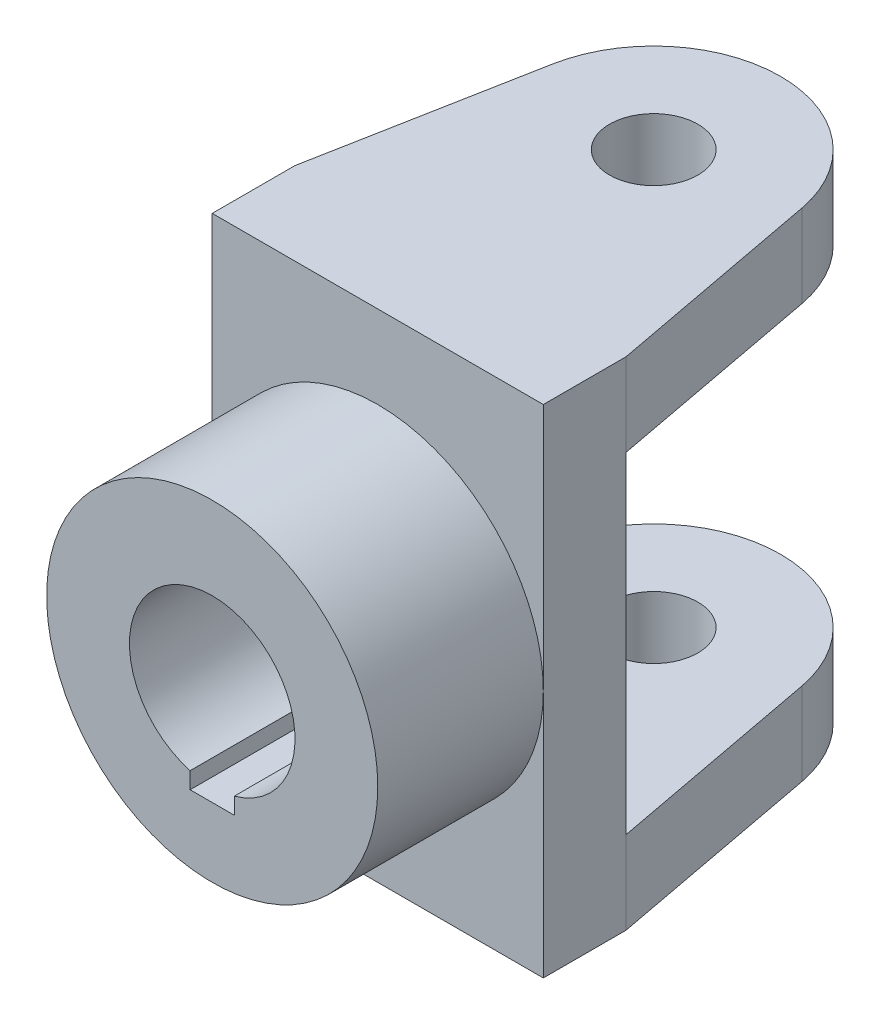
ISO-10303-21;
HEADER;
FILE_DESCRIPTION(('STEP AP214'),'2;1');
FILE_NAME('part.step','',(''),(''),'','','');
FILE_SCHEMA(('AUTOMOTIVE_DESIGN { 1 0 10303 214 1 1 1 1 }'));
ENDSEC;
DATA;
#1=APPLICATION_CONTEXT('core data for automotive mechanical design processes');
#2=APPLICATION_PROTOCOL_DEFINITION('international standard','automotive_design',2000,#1);
#3=PRODUCT_CONTEXT('',#1,'mechanical');
#4=PRODUCT('Part','Part','',(#3));
#5=PRODUCT_RELATED_PRODUCT_CATEGORY('part','',(#4));
#6=PRODUCT_DEFINITION_FORMATION('','',#4);
#7=PRODUCT_DEFINITION_CONTEXT('part definition',#1,'design');
#8=PRODUCT_DEFINITION('design','',#6,#7);
#9=PRODUCT_DEFINITION_SHAPE('','',#8);
#10=(LENGTH_UNIT() NAMED_UNIT(*) SI_UNIT(.MILLI.,.METRE.));
#11=(NAMED_UNIT(*) PLANE_ANGLE_UNIT() SI_UNIT($,.RADIAN.));
#12=(NAMED_UNIT(*) SI_UNIT($,.STERADIAN.) SOLID_ANGLE_UNIT());
#13=UNCERTAINTY_MEASURE_WITH_UNIT(LENGTH_MEASURE(1.E-05),#10,'distance_accuracy_value','');
#14=(GEOMETRIC_REPRESENTATION_CONTEXT(3) GLOBAL_UNCERTAINTY_ASSIGNED_CONTEXT((#13)) GLOBAL_UNIT_ASSIGNED_CONTEXT((#10,
#11,#12)) REPRESENTATION_CONTEXT('',''));
#15=CARTESIAN_POINT('',(0.,0.,0.));
#16=DIRECTION('',(0.,0.,1.));
#17=DIRECTION('',(1.,0.,0.));
#18=AXIS2_PLACEMENT_3D('',#15,#16,#17);
#19=CARTESIAN_POINT('',(22.6022234410614,-90.,-4.25904866376691));
#20=DIRECTION('',(0.98270536700267,0.,-0.185176028859431));
#21=DIRECTION('',(-0.185176028859431,0.,-0.98270536700267));
#22=AXIS2_PLACEMENT_3D('',#19,#20,#21);
#23=PLANE('',#22);
#24=DIRECTION('',(0.185176028859431,0.,0.98270536700267));
#25=VECTOR('',#24,1.);
#26=CARTESIAN_POINT('',(22.6022234410614,-15.,-4.25904866376691));
#27=LINE('',#26,#25);
#28=CARTESIAN_POINT('',(22.6022234410614,-15.,-4.25904866376691));
#29=VERTEX_POINT('',#28);
#30=CARTESIAN_POINT('',(30.,-15.,35.));
#31=VERTEX_POINT('',#30);
#32=EDGE_CURVE('E238',#29,#31,#27,.T.);
#33=ORIENTED_EDGE('',*,*,#32,.F.);
#34=DIRECTION('',(0.,1.,0.));
#35=VECTOR('',#34,1.);
#36=CARTESIAN_POINT('',(22.6022234410614,-90.,-4.25904866376691));
#37=LINE('',#36,#35);
#38=CARTESIAN_POINT('',(22.6022234410614,0.,-4.25904866376691));
#39=VERTEX_POINT('',#38);
#40=EDGE_CURVE('E185',#29,#39,#37,.T.);
#41=ORIENTED_EDGE('',*,*,#40,.T.);
#42=DIRECTION('',(-0.185176028859431,0.,-0.98270536700267));
#43=VECTOR('',#42,1.);
#44=CARTESIAN_POINT('',(22.6022234410614,0.,-4.25904866376691));
#45=LINE('',#44,#43);
#46=CARTESIAN_POINT('',(30.,0.,35.));
#47=VERTEX_POINT('',#46);
#48=EDGE_CURVE('E261',#47,#39,#45,.T.);
#49=ORIENTED_EDGE('',*,*,#48,.F.);
#50=DIRECTION('',(0.,1.,0.));
#51=VECTOR('',#50,1.);
#52=CARTESIAN_POINT('',(30.,-90.,35.));
#53=LINE('',#52,#51);
#54=EDGE_CURVE('E198',#31,#47,#53,.T.);
#55=ORIENTED_EDGE('',*,*,#54,.F.);
#56=EDGE_LOOP('',(#33,#41,#49,#55));
#57=FACE_BOUND('',#56,.T.);
#58=ADVANCED_FACE('F35',(#57),#23,.T.);
#59=CARTESIAN_POINT('',(-22.6022234410614,-90.,-4.25904866376691));
#60=DIRECTION('',(0.982705367002669,0.,0.185176028859431));
#61=DIRECTION('',(0.185176028859431,0.,-0.98270536700267));
#62=AXIS2_PLACEMENT_3D('',#59,#60,#61);
#63=PLANE('',#62);
#64=DIRECTION('',(0.,1.,0.));
#65=VECTOR('',#64,1.);
#66=CARTESIAN_POINT('',(-22.6022234410614,-90.,-4.2590486637669));
#67=LINE('',#66,#65);
#68=CARTESIAN_POINT('',(-22.6022234410614,-15.,-4.2590486637669));
#69=VERTEX_POINT('',#68);
#70=CARTESIAN_POINT('',(-22.6022234410614,0.,-4.2590486637669));
#71=VERTEX_POINT('',#70);
#72=EDGE_CURVE('E181',#69,#71,#67,.T.);
#73=ORIENTED_EDGE('',*,*,#72,.F.);
#74=DIRECTION('',(-0.185176028859431,0.,0.98270536700267));
#75=VECTOR('',#74,1.);
#76=CARTESIAN_POINT('',(-22.6022234410614,-15.,-4.25904866376691));
#77=LINE('',#76,#75);
#78=CARTESIAN_POINT('',(-30.,-15.,35.));
#79=VERTEX_POINT('',#78);
#80=EDGE_CURVE('E240',#69,#79,#77,.T.);
#81=ORIENTED_EDGE('',*,*,#80,.T.);
#82=DIRECTION('',(0.,1.,0.));
#83=VECTOR('',#82,1.);
#84=CARTESIAN_POINT('',(-30.,-90.,35.));
#85=LINE('',#84,#83);
#86=CARTESIAN_POINT('',(-30.,0.,35.));
#87=VERTEX_POINT('',#86);
#88=EDGE_CURVE('E168',#79,#87,#85,.T.);
#89=ORIENTED_EDGE('',*,*,#88,.T.);
#90=DIRECTION('',(0.185176028859431,0.,-0.982705367002669));
#91=VECTOR('',#90,1.);
#92=CARTESIAN_POINT('',(-22.6022234410614,0.,-4.25904866376691));
#93=LINE('',#92,#91);
#94=EDGE_CURVE('E299',#87,#71,#93,.T.);
#95=ORIENTED_EDGE('',*,*,#94,.T.);
#96=EDGE_LOOP('',(#73,#81,#89,#95));
#97=FACE_BOUND('',#96,.T.);
#98=ADVANCED_FACE('F325',(#97),#63,.F.);
#99=CARTESIAN_POINT('',(0.,-90.,0.));
#100=DIRECTION('',(0.,1.,0.));
#101=DIRECTION('',(0.,0.,1.));
#102=AXIS2_PLACEMENT_3D('',#99,#100,#101);
#103=CYLINDRICAL_SURFACE('',#102,23.);
#104=ORIENTED_EDGE('',*,*,#40,.F.);
#105=CARTESIAN_POINT('',(0.,-15.,0.));
#106=DIRECTION('',(0.,1.,0.));
#107=DIRECTION('',(0.,0.,1.));
#108=AXIS2_PLACEMENT_3D('',#105,#106,#107);
#109=CIRCLE('',#108,23.);
#110=EDGE_CURVE('E11',#69,#29,#109,.F.);
#111=ORIENTED_EDGE('',*,*,#110,.F.);
#112=ORIENTED_EDGE('',*,*,#72,.T.);
#113=CARTESIAN_POINT('',(0.,0.,0.));
#114=DIRECTION('',(0.,1.,0.));
#115=DIRECTION('',(0.,0.,1.));
#116=AXIS2_PLACEMENT_3D('',#113,#114,#115);
#117=CIRCLE('',#116,23.);
#118=EDGE_CURVE('E296',#39,#71,#117,.T.);
#119=ORIENTED_EDGE('',*,*,#118,.F.);
#120=EDGE_LOOP('',(#104,#111,#112,#119));
#121=FACE_BOUND('',#120,.T.);
#122=ADVANCED_FACE('F330',(#121),#103,.T.);
#123=CARTESIAN_POINT('',(0.,-90.,0.));
#124=DIRECTION('',(0.,1.,0.));
#125=DIRECTION('',(0.,0.,1.));
#126=AXIS2_PLACEMENT_3D('',#123,#124,#125);
#127=CYLINDRICAL_SURFACE('',#126,8.);
#128=CARTESIAN_POINT('',(0.,-15.,0.));
#129=DIRECTION('',(0.,1.,0.));
#130=DIRECTION('',(0.,0.,1.));
#131=AXIS2_PLACEMENT_3D('',#128,#129,#130);
#132=CIRCLE('',#131,8.);
#133=CARTESIAN_POINT('',(0.,-15.,8.));
#134=VERTEX_POINT('',#133);
#135=EDGE_CURVE('E235',#134,#134,#132,.F.);
#136=CARTESIAN_POINT('',(0.,0.,0.));
#137=DIRECTION('',(0.,1.,0.));
#138=DIRECTION('',(0.,0.,1.));
#139=AXIS2_PLACEMENT_3D('',#136,#137,#138);
#140=CIRCLE('',#139,8.);
#141=CARTESIAN_POINT('',(0.,0.,8.));
#142=VERTEX_POINT('',#141);
#143=EDGE_CURVE('E206',#142,#142,#140,.T.);
#144=CARTESIAN_POINT('',(0.,-15.,8.));
#145=CARTESIAN_POINT('',(0.,-14.84375,8.));
#146=CARTESIAN_POINT('',(0.,-14.6875,8.));
#147=CARTESIAN_POINT('',(0.,-14.375,8.));
#148=CARTESIAN_POINT('',(0.,-14.21875,8.));
#149=CARTESIAN_POINT('',(0.,-13.90625,8.));
#150=CARTESIAN_POINT('',(0.,-13.75,8.));
#151=CARTESIAN_POINT('',(0.,-13.4375,8.));
#152=CARTESIAN_POINT('',(0.,-13.28125,8.));
#153=CARTESIAN_POINT('',(0.,-12.96875,8.));
#154=CARTESIAN_POINT('',(0.,-12.8125,8.));
#155=CARTESIAN_POINT('',(0.,-12.5,8.));
#156=CARTESIAN_POINT('',(0.,-12.34375,8.));
#157=CARTESIAN_POINT('',(0.,-12.03125,8.));
#158=CARTESIAN_POINT('',(0.,-11.875,8.));
#159=CARTESIAN_POINT('',(0.,-11.5625,8.));
#160=CARTESIAN_POINT('',(0.,-11.40625,8.));
#161=CARTESIAN_POINT('',(0.,-11.09375,8.));
#162=CARTESIAN_POINT('',(0.,-10.9375,8.));
#163=CARTESIAN_POINT('',(0.,-10.625,8.));
#164=CARTESIAN_POINT('',(0.,-10.46875,8.));
#165=CARTESIAN_POINT('',(0.,-10.15625,8.));
#166=CARTESIAN_POINT('',(0.,-10.,8.));
#167=CARTESIAN_POINT('',(0.,-9.6875,8.));
#168=CARTESIAN_POINT('',(0.,-9.53125000000001,8.));
#169=CARTESIAN_POINT('',(0.,-9.21875000000001,8.));
#170=CARTESIAN_POINT('',(0.,-9.06250000000001,8.));
#171=CARTESIAN_POINT('',(0.,-8.75,8.));
#172=CARTESIAN_POINT('',(0.,-8.59375,8.));
#173=CARTESIAN_POINT('',(0.,-8.28125,8.));
#174=CARTESIAN_POINT('',(0.,-8.12500000000001,8.));
#175=CARTESIAN_POINT('',(0.,-7.81250000000001,8.));
#176=CARTESIAN_POINT('',(0.,-7.65625000000001,8.));
#177=CARTESIAN_POINT('',(0.,-7.34375000000001,8.));
#178=CARTESIAN_POINT('',(0.,-7.1875,8.));
#179=CARTESIAN_POINT('',(0.,-6.87500000000001,8.));
#180=CARTESIAN_POINT('',(0.,-6.71875000000001,8.));
#181=CARTESIAN_POINT('',(0.,-6.40625000000001,8.));
#182=CARTESIAN_POINT('',(0.,-6.25000000000001,8.));
#183=CARTESIAN_POINT('',(0.,-5.93750000000001,8.));
#184=CARTESIAN_POINT('',(0.,-5.78125000000001,8.));
#185=CARTESIAN_POINT('',(0.,-5.46875000000001,8.));
#186=CARTESIAN_POINT('',(0.,-5.31250000000001,8.));
#187=CARTESIAN_POINT('',(0.,-5.00000000000001,8.));
#188=CARTESIAN_POINT('',(0.,-4.84375000000001,8.));
#189=CARTESIAN_POINT('',(0.,-4.53125000000001,8.));
#190=CARTESIAN_POINT('',(0.,-4.37500000000001,8.));
#191=CARTESIAN_POINT('',(0.,-4.06250000000001,8.));
#192=CARTESIAN_POINT('',(0.,-3.90625000000001,8.));
#193=CARTESIAN_POINT('',(0.,-3.59375000000002,8.));
#194=CARTESIAN_POINT('',(0.,-3.43750000000001,8.));
#195=CARTESIAN_POINT('',(0.,-3.12500000000001,8.));
#196=CARTESIAN_POINT('',(0.,-2.96875000000001,8.));
#197=CARTESIAN_POINT('',(0.,-2.65625000000001,8.));
#198=CARTESIAN_POINT('',(0.,-2.50000000000002,8.));
#199=CARTESIAN_POINT('',(0.,-2.18750000000002,8.));
#200=CARTESIAN_POINT('',(0.,-2.03125000000002,8.));
#201=CARTESIAN_POINT('',(0.,-1.71875000000001,8.));
#202=CARTESIAN_POINT('',(0.,-1.56250000000001,8.));
#203=CARTESIAN_POINT('',(0.,-1.25000000000001,8.));
#204=CARTESIAN_POINT('',(0.,-1.09375000000001,8.));
#205=CARTESIAN_POINT('',(0.,-0.781250000000011,8.));
#206=CARTESIAN_POINT('',(0.,-0.625000000000014,8.));
#207=CARTESIAN_POINT('',(0.,-0.312500000000016,8.));
#208=CARTESIAN_POINT('',(0.,-0.156250000000015,8.));
#209=CARTESIAN_POINT('',(0.,0.,8.));
#210=B_SPLINE_CURVE_WITH_KNOTS('',3,(#144,#145,#146,#147,#148,#149,#150,#151,#152,#153,#154,
#155,#156,#157,#158,#159,#160,#161,#162,#163,#164,#165,#166,#167,#168,#169,#170,#171,#172,#173,
#174,#175,#176,#177,#178,#179,#180,#181,#182,#183,#184,#185,#186,#187,#188,#189,#190,#191,#192,
#193,#194,#195,#196,#197,#198,#199,#200,#201,#202,#203,#204,#205,#206,#207,#208,#209),
.UNSPECIFIED.,.F.,.F.,(4,2,2,2,2,2,2,2,2,2,2,2,2,2,2,2,2,2,2,2,2,2,2,2,2,2,2,2,2,2,2,2,4),(0.,
0.468750000000004,0.937499999999994,1.40625,1.875,2.34374999999999,2.8125,3.28125,3.75,
4.21874999999999,4.6875,5.15625,5.62499999999999,6.09374999999999,6.5625,7.03124999999999,
7.49999999999999,7.96875,8.43749999999999,8.90624999999999,9.37499999999999,9.84374999999998,
10.3125,10.78125,11.25,11.71875,12.1875,12.65625,13.125,13.59375,14.0625,14.53125,15.),.UNSPECIFIED.);
#211=EDGE_CURVE('BSEAM332',#134,#142,#210,.T.);
#212=ORIENTED_EDGE('',*,*,#135,.T.);
#213=ORIENTED_EDGE('',*,*,#143,.T.);
#214=ORIENTED_EDGE('',*,*,#211,.T.);
#215=ORIENTED_EDGE('',*,*,#211,.F.);
#216=EDGE_LOOP('',(#212,#214,#213,#215));
#217=FACE_BOUND('',#216,.T.);
#218=ADVANCED_FACE('F332',(#217),#127,.F.);
#219=CARTESIAN_POINT('',(0.,-90.,50.));
#220=DIRECTION('',(0.,0.,1.));
#221=DIRECTION('',(1.,0.,0.));
#222=AXIS2_PLACEMENT_3D('',#219,#220,#221);
#223=PLANE('',#222);
#224=CARTESIAN_POINT('',(0.,-45.,50.));
#225=DIRECTION('',(0.,0.,1.));
#226=DIRECTION('',(1.,0.,0.));
#227=AXIS2_PLACEMENT_3D('',#224,#225,#226);
#228=CIRCLE('',#227,30.);
#229=CARTESIAN_POINT('',(30.,-45.,50.));
#230=VERTEX_POINT('',#229);
#231=CARTESIAN_POINT('',(-30.,-45.,50.));
#232=VERTEX_POINT('',#231);
#233=EDGE_CURVE('E194',#230,#232,#228,.T.);
#234=ORIENTED_EDGE('',*,*,#233,.F.);
#235=DIRECTION('',(0.,1.,0.));
#236=VECTOR('',#235,1.);
#237=CARTESIAN_POINT('',(30.,-90.,50.));
#238=LINE('',#237,#236);
#239=CARTESIAN_POINT('',(30.,0.,50.));
#240=VERTEX_POINT('',#239);
#241=EDGE_CURVE('E309',#230,#240,#238,.T.);
#242=ORIENTED_EDGE('',*,*,#241,.T.);
#243=DIRECTION('',(1.,0.,0.));
#244=VECTOR('',#243,1.);
#245=CARTESIAN_POINT('',(0.,0.,50.));
#246=LINE('',#245,#244);
#247=CARTESIAN_POINT('',(-30.,0.,50.));
#248=VERTEX_POINT('',#247);
#249=EDGE_CURVE('E305',#248,#240,#246,.T.);
#250=ORIENTED_EDGE('',*,*,#249,.F.);
#251=DIRECTION('',(0.,1.,0.));
#252=VECTOR('',#251,1.);
#253=CARTESIAN_POINT('',(-30.,-90.,50.));
#254=LINE('',#253,#252);
#255=EDGE_CURVE('E173',#232,#248,#254,.T.);
#256=ORIENTED_EDGE('',*,*,#255,.F.);
#257=EDGE_LOOP('',(#234,#242,#250,#256));
#258=FACE_BOUND('',#257,.T.);
#259=ADVANCED_FACE('F318',(#258),#223,.T.);
#260=DIRECTION('',(-0.185176028859431,0.,-0.98270536700267));
#261=VECTOR('',#260,1.);
#262=CARTESIAN_POINT('',(22.6022234410614,-75.,-4.25904866376691));
#263=LINE('',#262,#261);
#264=CARTESIAN_POINT('',(30.,-75.,35.));
#265=VERTEX_POINT('',#264);
#266=CARTESIAN_POINT('',(22.6022234410614,-75.,-4.25904866376691));
#267=VERTEX_POINT('',#266);
#268=EDGE_CURVE('E50',#265,#267,#263,.T.);
#269=ORIENTED_EDGE('',*,*,#268,.F.);
#270=CARTESIAN_POINT('',(30.,-90.,35.));
#271=VERTEX_POINT('',#270);
#272=EDGE_CURVE('E192',#271,#265,#53,.T.);
#273=ORIENTED_EDGE('',*,*,#272,.F.);
#274=DIRECTION('',(-0.185176028859431,0.,-0.98270536700267));
#275=VECTOR('',#274,1.);
#276=CARTESIAN_POINT('',(22.6022234410614,-90.,-4.25904866376691));
#277=LINE('',#276,#275);
#278=CARTESIAN_POINT('',(22.6022234410614,-90.,-4.25904866376691));
#279=VERTEX_POINT('',#278);
#280=EDGE_CURVE('E274',#271,#279,#277,.T.);
#281=ORIENTED_EDGE('',*,*,#280,.T.);
#282=EDGE_CURVE('E182',#279,#267,#37,.T.);
#283=ORIENTED_EDGE('',*,*,#282,.T.);
#284=EDGE_LOOP('',(#269,#273,#281,#283));
#285=FACE_BOUND('',#284,.T.);
#286=ADVANCED_FACE('F273',(#285),#23,.T.);
#287=CARTESIAN_POINT('',(30.,-90.,0.));
#288=DIRECTION('',(-1.,0.,0.));
#289=DIRECTION('',(0.,0.,1.));
#290=AXIS2_PLACEMENT_3D('',#287,#288,#289);
#291=PLANE('',#290);
#292=DIRECTION('',(0.,0.,1.));
#293=VECTOR('',#292,1.);
#294=CARTESIAN_POINT('',(30.,0.,0.));
#295=LINE('',#294,#293);
#296=EDGE_CURVE('E308',#47,#240,#295,.T.);
#297=ORIENTED_EDGE('',*,*,#296,.T.);
#298=ORIENTED_EDGE('',*,*,#241,.F.);
#299=CARTESIAN_POINT('',(30.,-90.,50.));
#300=VERTEX_POINT('',#299);
#301=EDGE_CURVE('E265',#300,#230,#238,.T.);
#302=ORIENTED_EDGE('',*,*,#301,.F.);
#303=DIRECTION('',(0.,0.,1.));
#304=VECTOR('',#303,1.);
#305=CARTESIAN_POINT('',(30.,-90.,0.));
#306=LINE('',#305,#304);
#307=EDGE_CURVE('E269',#271,#300,#306,.T.);
#308=ORIENTED_EDGE('',*,*,#307,.F.);
#309=ORIENTED_EDGE('',*,*,#272,.T.);
#310=DIRECTION('',(0.,-1.,0.));
#311=VECTOR('',#310,1.);
#312=CARTESIAN_POINT('',(30.,-15.,35.));
#313=LINE('',#312,#311);
#314=EDGE_CURVE('E158',#31,#265,#313,.T.);
#315=ORIENTED_EDGE('',*,*,#314,.F.);
#316=ORIENTED_EDGE('',*,*,#54,.T.);
#317=EDGE_LOOP('',(#297,#298,#302,#308,#309,#315,#316));
#318=FACE_BOUND('',#317,.T.);
#319=ADVANCED_FACE('F266',(#318),#291,.F.);
#320=EDGE_CURVE('E187',#232,#230,#228,.T.);
#321=ORIENTED_EDGE('',*,*,#320,.F.);
#322=CARTESIAN_POINT('',(-30.,-90.,50.));
#323=VERTEX_POINT('',#322);
#324=EDGE_CURVE('E175',#323,#232,#254,.T.);
#325=ORIENTED_EDGE('',*,*,#324,.F.);
#326=DIRECTION('',(1.,0.,0.));
#327=VECTOR('',#326,1.);
#328=CARTESIAN_POINT('',(0.,-90.,50.));
#329=LINE('',#328,#327);
#330=EDGE_CURVE('E289',#323,#300,#329,.T.);
#331=ORIENTED_EDGE('',*,*,#330,.T.);
#332=ORIENTED_EDGE('',*,*,#301,.T.);
#333=EDGE_LOOP('',(#321,#325,#331,#332));
#334=FACE_BOUND('',#333,.T.);
#335=ADVANCED_FACE('F317',(#334),#223,.T.);
#336=CARTESIAN_POINT('',(-30.,-90.,0.));
#337=DIRECTION('',(-1.,0.,0.));
#338=DIRECTION('',(0.,0.,1.));
#339=AXIS2_PLACEMENT_3D('',#336,#337,#338);
#340=PLANE('',#339);
#341=DIRECTION('',(0.,0.,1.));
#342=VECTOR('',#341,1.);
#343=CARTESIAN_POINT('',(-30.,0.,0.));
#344=LINE('',#343,#342);
#345=EDGE_CURVE('E302',#87,#248,#344,.T.);
#346=ORIENTED_EDGE('',*,*,#345,.F.);
#347=ORIENTED_EDGE('',*,*,#88,.F.);
#348=DIRECTION('',(0.,-1.,0.));
#349=VECTOR('',#348,1.);
#350=CARTESIAN_POINT('',(-30.,-15.,35.));
#351=LINE('',#350,#349);
#352=CARTESIAN_POINT('',(-30.,-75.,35.));
#353=VERTEX_POINT('',#352);
#354=EDGE_CURVE('E155',#79,#353,#351,.T.);
#355=ORIENTED_EDGE('',*,*,#354,.T.);
#356=CARTESIAN_POINT('',(-30.,-90.,35.));
#357=VERTEX_POINT('',#356);
#358=EDGE_CURVE('E166',#357,#353,#85,.T.);
#359=ORIENTED_EDGE('',*,*,#358,.F.);
#360=DIRECTION('',(0.,0.,1.));
#361=VECTOR('',#360,1.);
#362=CARTESIAN_POINT('',(-30.,-90.,0.));
#363=LINE('',#362,#361);
#364=EDGE_CURVE('E283',#357,#323,#363,.T.);
#365=ORIENTED_EDGE('',*,*,#364,.T.);
#366=ORIENTED_EDGE('',*,*,#324,.T.);
#367=ORIENTED_EDGE('',*,*,#255,.T.);
#368=EDGE_LOOP('',(#346,#347,#355,#359,#365,#366,#367));
#369=FACE_BOUND('',#368,.T.);
#370=ADVANCED_FACE('F164',(#369),#340,.T.);
#371=ORIENTED_EDGE('',*,*,#358,.T.);
#372=DIRECTION('',(0.185176028859431,0.,-0.982705367002669));
#373=VECTOR('',#372,1.);
#374=CARTESIAN_POINT('',(-22.6022234410614,-75.,-4.25904866376691));
#375=LINE('',#374,#373);
#376=CARTESIAN_POINT('',(-22.6022234410614,-75.,-4.2590486637669));
#377=VERTEX_POINT('',#376);
#378=EDGE_CURVE('E139',#353,#377,#375,.T.);
#379=ORIENTED_EDGE('',*,*,#378,.T.);
#380=CARTESIAN_POINT('',(-22.6022234410614,-90.,-4.2590486637669));
#381=VERTEX_POINT('',#380);
#382=EDGE_CURVE('E177',#381,#377,#67,.T.);
#383=ORIENTED_EDGE('',*,*,#382,.F.);
#384=DIRECTION('',(0.185176028859431,0.,-0.982705367002669));
#385=VECTOR('',#384,1.);
#386=CARTESIAN_POINT('',(-22.6022234410614,-90.,-4.25904866376691));
#387=LINE('',#386,#385);
#388=EDGE_CURVE('E171',#357,#381,#387,.T.);
#389=ORIENTED_EDGE('',*,*,#388,.F.);
#390=EDGE_LOOP('',(#371,#379,#383,#389));
#391=FACE_BOUND('',#390,.T.);
#392=ADVANCED_FACE('F170',(#391),#63,.F.);
#393=CARTESIAN_POINT('',(0.,-75.,0.));
#394=DIRECTION('',(0.,-1.,0.));
#395=DIRECTION('',(0.,0.,-1.));
#396=AXIS2_PLACEMENT_3D('',#393,#394,#395);
#397=CIRCLE('',#396,8.);
#398=CARTESIAN_POINT('',(0.,-75.,8.));
#399=VERTEX_POINT('',#398);
#400=EDGE_CURVE('E242',#399,#399,#397,.F.);
#401=CARTESIAN_POINT('',(0.,-90.,0.));
#402=DIRECTION('',(0.,1.,0.));
#403=DIRECTION('',(0.,0.,1.));
#404=AXIS2_PLACEMENT_3D('',#401,#402,#403);
#405=CIRCLE('',#404,8.);
#406=CARTESIAN_POINT('',(0.,-90.,8.));
#407=VERTEX_POINT('',#406);
#408=EDGE_CURVE('E285',#407,#407,#405,.T.);
#409=CARTESIAN_POINT('',(0.,-75.,8.));
#410=CARTESIAN_POINT('',(0.,-75.15625,8.));
#411=CARTESIAN_POINT('',(0.,-75.3125,8.));
#412=CARTESIAN_POINT('',(0.,-75.625,8.));
#413=CARTESIAN_POINT('',(0.,-75.78125,8.));
#414=CARTESIAN_POINT('',(0.,-76.09375,8.));
#415=CARTESIAN_POINT('',(0.,-76.25,8.));
#416=CARTESIAN_POINT('',(0.,-76.5625,8.));
#417=CARTESIAN_POINT('',(0.,-76.71875,8.));
#418=CARTESIAN_POINT('',(0.,-77.03125,8.));
#419=CARTESIAN_POINT('',(0.,-77.1875,8.));
#420=CARTESIAN_POINT('',(0.,-77.5,8.));
#421=CARTESIAN_POINT('',(0.,-77.65625,8.));
#422=CARTESIAN_POINT('',(0.,-77.96875,8.));
#423=CARTESIAN_POINT('',(0.,-78.125,8.));
#424=CARTESIAN_POINT('',(0.,-78.4375,8.));
#425=CARTESIAN_POINT('',(0.,-78.59375,8.));
#426=CARTESIAN_POINT('',(0.,-78.90625,8.));
#427=CARTESIAN_POINT('',(0.,-79.0625,8.));
#428=CARTESIAN_POINT('',(0.,-79.375,8.));
#429=CARTESIAN_POINT('',(0.,-79.53125,8.));
#430=CARTESIAN_POINT('',(0.,-79.84375,8.));
#431=CARTESIAN_POINT('',(0.,-80.,8.));
#432=CARTESIAN_POINT('',(0.,-80.3125,8.));
#433=CARTESIAN_POINT('',(0.,-80.46875,8.));
#434=CARTESIAN_POINT('',(0.,-80.78125,8.));
#435=CARTESIAN_POINT('',(0.,-80.9375,8.));
#436=CARTESIAN_POINT('',(0.,-81.25,8.));
#437=CARTESIAN_POINT('',(0.,-81.40625,8.));
#438=CARTESIAN_POINT('',(0.,-81.71875,8.));
#439=CARTESIAN_POINT('',(0.,-81.875,8.));
#440=CARTESIAN_POINT('',(0.,-82.1875,8.));
#441=CARTESIAN_POINT('',(0.,-82.34375,8.));
#442=CARTESIAN_POINT('',(0.,-82.65625,8.));
#443=CARTESIAN_POINT('',(0.,-82.8125,8.));
#444=CARTESIAN_POINT('',(0.,-83.125,8.));
#445=CARTESIAN_POINT('',(0.,-83.28125,8.));
#446=CARTESIAN_POINT('',(0.,-83.59375,8.));
#447=CARTESIAN_POINT('',(0.,-83.75,8.));
#448=CARTESIAN_POINT('',(0.,-84.0625,8.));
#449=CARTESIAN_POINT('',(0.,-84.21875,8.));
#450=CARTESIAN_POINT('',(0.,-84.53125,8.));
#451=CARTESIAN_POINT('',(0.,-84.6875,8.));
#452=CARTESIAN_POINT('',(0.,-85.,8.));
#453=CARTESIAN_POINT('',(0.,-85.15625,8.));
#454=CARTESIAN_POINT('',(0.,-85.46875,8.));
#455=CARTESIAN_POINT('',(0.,-85.625,8.));
#456=CARTESIAN_POINT('',(0.,-85.9375,8.));
#457=CARTESIAN_POINT('',(0.,-86.09375,8.));
#458=CARTESIAN_POINT('',(0.,-86.40625,8.));
#459=CARTESIAN_POINT('',(0.,-86.5625,8.));
#460=CARTESIAN_POINT('',(0.,-86.875,8.));
#461=CARTESIAN_POINT('',(0.,-87.03125,8.));
#462=CARTESIAN_POINT('',(0.,-87.34375,8.));
#463=CARTESIAN_POINT('',(0.,-87.5,8.));
#464=CARTESIAN_POINT('',(0.,-87.8125,8.));
#465=CARTESIAN_POINT('',(0.,-87.96875,8.));
#466=CARTESIAN_POINT('',(0.,-88.28125,8.));
#467=CARTESIAN_POINT('',(0.,-88.4375,8.));
#468=CARTESIAN_POINT('',(0.,-88.75,8.));
#469=CARTESIAN_POINT('',(0.,-88.90625,8.));
#470=CARTESIAN_POINT('',(0.,-89.21875,8.));
#471=CARTESIAN_POINT('',(0.,-89.375,8.));
#472=CARTESIAN_POINT('',(0.,-89.6875,8.));
#473=CARTESIAN_POINT('',(0.,-89.84375,8.));
#474=CARTESIAN_POINT('',(0.,-90.,8.));
#475=B_SPLINE_CURVE_WITH_KNOTS('',3,(#409,#410,#411,#412,#413,#414,#415,#416,#417,#418,#419,
#420,#421,#422,#423,#424,#425,#426,#427,#428,#429,#430,#431,#432,#433,#434,#435,#436,#437,#438,
#439,#440,#441,#442,#443,#444,#445,#446,#447,#448,#449,#450,#451,#452,#453,#454,#455,#456,#457,
#458,#459,#460,#461,#462,#463,#464,#465,#466,#467,#468,#469,#470,#471,#472,#473,#474),
.UNSPECIFIED.,.F.,.F.,(4,2,2,2,2,2,2,2,2,2,2,2,2,2,2,2,2,2,2,2,2,2,2,2,2,2,2,2,2,2,2,2,4),(0.,
0.46874999999999,0.937499999999994,1.40625,1.875,2.34374999999999,2.8125,3.28125,3.75,
4.21874999999999,4.6875,5.15625,5.62500000000001,6.09374999999999,6.5625,7.03125,
7.50000000000001,7.96875,8.4375,8.90625,9.37500000000001,9.84375,10.3125,10.78125,11.25,
11.71875,12.1875,12.65625,13.125,13.59375,14.0625,14.53125,15.),.UNSPECIFIED.);
#476=EDGE_CURVE('BSEAM37',#399,#407,#475,.T.);
#477=ORIENTED_EDGE('',*,*,#400,.T.);
#478=ORIENTED_EDGE('',*,*,#408,.F.);
#479=ORIENTED_EDGE('',*,*,#476,.T.);
#480=ORIENTED_EDGE('',*,*,#476,.F.);
#481=EDGE_LOOP('',(#477,#479,#478,#480));
#482=FACE_BOUND('',#481,.T.);
#483=ADVANCED_FACE('F37',(#482),#127,.F.);
#484=ORIENTED_EDGE('',*,*,#382,.T.);
#485=CARTESIAN_POINT('',(0.,-75.,0.));
#486=DIRECTION('',(0.,-1.,0.));
#487=DIRECTION('',(0.,0.,-1.));
#488=AXIS2_PLACEMENT_3D('',#485,#486,#487);
#489=CIRCLE('',#488,23.);
#490=EDGE_CURVE('E43',#267,#377,#489,.F.);
#491=ORIENTED_EDGE('',*,*,#490,.F.);
#492=ORIENTED_EDGE('',*,*,#282,.F.);
#493=CARTESIAN_POINT('',(0.,-90.,0.));
#494=DIRECTION('',(0.,1.,0.));
#495=DIRECTION('',(0.,0.,1.));
#496=AXIS2_PLACEMENT_3D('',#493,#494,#495);
#497=CIRCLE('',#496,23.);
#498=EDGE_CURVE('E279',#279,#381,#497,.T.);
#499=ORIENTED_EDGE('',*,*,#498,.T.);
#500=EDGE_LOOP('',(#484,#491,#492,#499));
#501=FACE_BOUND('',#500,.T.);
#502=ADVANCED_FACE('F278',(#501),#103,.T.);
#503=CARTESIAN_POINT('',(0.,-90.,0.));
#504=DIRECTION('',(0.,1.,0.));
#505=DIRECTION('',(0.,0.,1.));
#506=AXIS2_PLACEMENT_3D('',#503,#504,#505);
#507=PLANE('',#506);
#508=ORIENTED_EDGE('',*,*,#408,.T.);
#509=EDGE_LOOP('',(#508));
#510=FACE_BOUND('',#509,.T.);
#511=ORIENTED_EDGE('',*,*,#280,.F.);
#512=ORIENTED_EDGE('',*,*,#307,.T.);
#513=ORIENTED_EDGE('',*,*,#330,.F.);
#514=ORIENTED_EDGE('',*,*,#364,.F.);
#515=ORIENTED_EDGE('',*,*,#388,.T.);
#516=ORIENTED_EDGE('',*,*,#498,.F.);
#517=EDGE_LOOP('',(#511,#512,#513,#514,#515,#516));
#518=FACE_BOUND('',#517,.T.);
#519=ADVANCED_FACE('F281',(#510,#518),#507,.F.);
#520=CARTESIAN_POINT('',(0.,0.,0.));
#521=DIRECTION('',(0.,1.,0.));
#522=DIRECTION('',(0.,0.,1.));
#523=AXIS2_PLACEMENT_3D('',#520,#521,#522);
#524=PLANE('',#523);
#525=ORIENTED_EDGE('',*,*,#143,.F.);
#526=EDGE_LOOP('',(#525));
#527=FACE_BOUND('',#526,.T.);
#528=ORIENTED_EDGE('',*,*,#48,.T.);
#529=ORIENTED_EDGE('',*,*,#118,.T.);
#530=ORIENTED_EDGE('',*,*,#94,.F.);
#531=ORIENTED_EDGE('',*,*,#345,.T.);
#532=ORIENTED_EDGE('',*,*,#249,.T.);
#533=ORIENTED_EDGE('',*,*,#296,.F.);
#534=EDGE_LOOP('',(#528,#529,#530,#531,#532,#533));
#535=FACE_BOUND('',#534,.T.);
#536=ADVANCED_FACE('F321',(#527,#535),#524,.T.);
#537=CARTESIAN_POINT('',(0.,-45.,80.));
#538=DIRECTION('',(0.,0.,-1.));
#539=DIRECTION('',(-1.,0.,0.));
#540=AXIS2_PLACEMENT_3D('',#537,#538,#539);
#541=CYLINDRICAL_SURFACE('',#540,30.);
#542=CARTESIAN_POINT('',(0.,-45.,80.));
#543=DIRECTION('',(0.,0.,1.));
#544=DIRECTION('',(1.,0.,0.));
#545=AXIS2_PLACEMENT_3D('',#542,#543,#544);
#546=CIRCLE('',#545,30.);
#547=CARTESIAN_POINT('',(30.,-45.,80.));
#548=VERTEX_POINT('',#547);
#549=EDGE_CURVE('E202',#548,#548,#546,.T.);
#550=ORIENTED_EDGE('',*,*,#549,.F.);
#551=EDGE_LOOP('',(#550));
#552=FACE_BOUND('',#551,.T.);
#553=ORIENTED_EDGE('',*,*,#233,.T.);
#554=ORIENTED_EDGE('',*,*,#320,.T.);
#555=EDGE_LOOP('',(#553,#554));
#556=FACE_BOUND('',#555,.T.);
#557=ADVANCED_FACE('F377',(#552,#556),#541,.T.);
#558=CARTESIAN_POINT('',(0.,-45.,80.));
#559=DIRECTION('',(0.,0.,1.));
#560=DIRECTION('',(1.,0.,0.));
#561=AXIS2_PLACEMENT_3D('',#558,#559,#560);
#562=PLANE('',#561);
#563=CARTESIAN_POINT('',(0.,-45.,80.));
#564=DIRECTION('',(0.,0.,1.));
#565=DIRECTION('',(1.,0.,0.));
#566=AXIS2_PLACEMENT_3D('',#563,#564,#565);
#567=CIRCLE('',#566,15.);
#568=CARTESIAN_POINT('',(4.,-59.456832294801,80.));
#569=VERTEX_POINT('',#568);
#570=CARTESIAN_POINT('',(-4.,-59.456832294801,80.));
#571=VERTEX_POINT('',#570);
#572=EDGE_CURVE('E231',#569,#571,#567,.T.);
#573=ORIENTED_EDGE('',*,*,#572,.F.);
#574=DIRECTION('',(0.,1.,0.));
#575=VECTOR('',#574,1.);
#576=CARTESIAN_POINT('',(4.,-62.456832294801,80.));
#577=LINE('',#576,#575);
#578=CARTESIAN_POINT('',(4.,-62.456832294801,80.));
#579=VERTEX_POINT('',#578);
#580=EDGE_CURVE('E216',#579,#569,#577,.T.);
#581=ORIENTED_EDGE('',*,*,#580,.F.);
#582=DIRECTION('',(1.,0.,0.));
#583=VECTOR('',#582,1.);
#584=CARTESIAN_POINT('',(-4.,-62.456832294801,80.));
#585=LINE('',#584,#583);
#586=CARTESIAN_POINT('',(-4.,-62.456832294801,80.));
#587=VERTEX_POINT('',#586);
#588=EDGE_CURVE('E222',#587,#579,#585,.T.);
#589=ORIENTED_EDGE('',*,*,#588,.F.);
#590=DIRECTION('',(0.,-1.,0.));
#591=VECTOR('',#590,1.);
#592=CARTESIAN_POINT('',(-4.,-62.456832294801,80.));
#593=LINE('',#592,#591);
#594=EDGE_CURVE('E227',#571,#587,#593,.T.);
#595=ORIENTED_EDGE('',*,*,#594,.F.);
#596=EDGE_LOOP('',(#573,#581,#589,#595));
#597=FACE_BOUND('',#596,.T.);
#598=ORIENTED_EDGE('',*,*,#549,.T.);
#599=EDGE_LOOP('',(#598));
#600=FACE_BOUND('',#599,.T.);
#601=ADVANCED_FACE('F383',(#597,#600),#562,.T.);
#602=CARTESIAN_POINT('',(0.,-45.,-23.));
#603=DIRECTION('',(0.,0.,1.));
#604=DIRECTION('',(1.,0.,0.));
#605=AXIS2_PLACEMENT_3D('',#602,#603,#604);
#606=CYLINDRICAL_SURFACE('',#605,15.);
#607=DIRECTION('',(0.,0.,1.));
#608=VECTOR('',#607,1.);
#609=CARTESIAN_POINT('',(-4.,-59.456832294801,-23.));
#610=LINE('',#609,#608);
#611=CARTESIAN_POINT('',(-4.,-59.456832294801,35.));
#612=VERTEX_POINT('',#611);
#613=EDGE_CURVE('E220',#612,#571,#610,.T.);
#614=ORIENTED_EDGE('',*,*,#613,.F.);
#615=CARTESIAN_POINT('',(0.,-45.,35.));
#616=DIRECTION('',(0.,0.,1.));
#617=DIRECTION('',(1.,0.,0.));
#618=AXIS2_PLACEMENT_3D('',#615,#616,#617);
#619=CIRCLE('',#618,15.);
#620=CARTESIAN_POINT('',(4.,-59.456832294801,35.));
#621=VERTEX_POINT('',#620);
#622=EDGE_CURVE('E58',#612,#621,#619,.F.);
#623=ORIENTED_EDGE('',*,*,#622,.T.);
#624=DIRECTION('',(0.,0.,1.));
#625=VECTOR('',#624,1.);
#626=CARTESIAN_POINT('',(4.,-59.456832294801,-23.));
#627=LINE('',#626,#625);
#628=EDGE_CURVE('E203',#621,#569,#627,.T.);
#629=ORIENTED_EDGE('',*,*,#628,.T.);
#630=ORIENTED_EDGE('',*,*,#572,.T.);
#631=EDGE_LOOP('',(#614,#623,#629,#630));
#632=FACE_BOUND('',#631,.T.);
#633=ADVANCED_FACE('F387',(#632),#606,.F.);
#634=CARTESIAN_POINT('',(4.,-62.456832294801,-23.));
#635=DIRECTION('',(1.,0.,0.));
#636=DIRECTION('',(0.,0.,-1.));
#637=AXIS2_PLACEMENT_3D('',#634,#635,#636);
#638=PLANE('',#637);
#639=ORIENTED_EDGE('',*,*,#628,.F.);
#640=DIRECTION('',(0.,-1.,0.));
#641=VECTOR('',#640,1.);
#642=CARTESIAN_POINT('',(4.,-62.456832294801,35.));
#643=LINE('',#642,#641);
#644=CARTESIAN_POINT('',(4.,-62.456832294801,35.));
#645=VERTEX_POINT('',#644);
#646=EDGE_CURVE('E247',#621,#645,#643,.T.);
#647=ORIENTED_EDGE('',*,*,#646,.T.);
#648=DIRECTION('',(0.,0.,1.));
#649=VECTOR('',#648,1.);
#650=CARTESIAN_POINT('',(4.,-62.456832294801,-23.));
#651=LINE('',#650,#649);
#652=EDGE_CURVE('E207',#645,#579,#651,.T.);
#653=ORIENTED_EDGE('',*,*,#652,.T.);
#654=ORIENTED_EDGE('',*,*,#580,.T.);
#655=EDGE_LOOP('',(#639,#647,#653,#654));
#656=FACE_BOUND('',#655,.T.);
#657=ADVANCED_FACE('F391',(#656),#638,.F.);
#658=CARTESIAN_POINT('',(-4.,-62.456832294801,-23.));
#659=DIRECTION('',(0.,-1.,0.));
#660=DIRECTION('',(0.,0.,-1.));
#661=AXIS2_PLACEMENT_3D('',#658,#659,#660);
#662=PLANE('',#661);
#663=ORIENTED_EDGE('',*,*,#652,.F.);
#664=DIRECTION('',(-1.,0.,0.));
#665=VECTOR('',#664,1.);
#666=CARTESIAN_POINT('',(-3.99999999999997,-62.456832294801,35.));
#667=LINE('',#666,#665);
#668=CARTESIAN_POINT('',(-4.,-62.456832294801,35.));
#669=VERTEX_POINT('',#668);
#670=EDGE_CURVE('E250',#645,#669,#667,.T.);
#671=ORIENTED_EDGE('',*,*,#670,.T.);
#672=DIRECTION('',(0.,0.,1.));
#673=VECTOR('',#672,1.);
#674=CARTESIAN_POINT('',(-4.,-62.456832294801,-23.));
#675=LINE('',#674,#673);
#676=EDGE_CURVE('E213',#669,#587,#675,.T.);
#677=ORIENTED_EDGE('',*,*,#676,.T.);
#678=ORIENTED_EDGE('',*,*,#588,.T.);
#679=EDGE_LOOP('',(#663,#671,#677,#678));
#680=FACE_BOUND('',#679,.T.);
#681=ADVANCED_FACE('F395',(#680),#662,.F.);
#682=CARTESIAN_POINT('',(-4.,-62.456832294801,-23.));
#683=DIRECTION('',(-1.,0.,0.));
#684=DIRECTION('',(0.,0.,1.));
#685=AXIS2_PLACEMENT_3D('',#682,#683,#684);
#686=PLANE('',#685);
#687=ORIENTED_EDGE('',*,*,#676,.F.);
#688=DIRECTION('',(0.,1.,0.));
#689=VECTOR('',#688,1.);
#690=CARTESIAN_POINT('',(-4.,-62.456832294801,35.));
#691=LINE('',#690,#689);
#692=EDGE_CURVE('E186',#669,#612,#691,.T.);
#693=ORIENTED_EDGE('',*,*,#692,.T.);
#694=ORIENTED_EDGE('',*,*,#613,.T.);
#695=ORIENTED_EDGE('',*,*,#594,.T.);
#696=EDGE_LOOP('',(#687,#693,#694,#695));
#697=FACE_BOUND('',#696,.T.);
#698=ADVANCED_FACE('F392',(#697),#686,.F.);
#699=CARTESIAN_POINT('',(-30.,-15.,35.));
#700=DIRECTION('',(0.,1.,0.));
#701=DIRECTION('',(0.,0.,1.));
#702=AXIS2_PLACEMENT_3D('',#699,#700,#701);
#703=PLANE('',#702);
#704=ORIENTED_EDGE('',*,*,#32,.T.);
#705=DIRECTION('',(1.,0.,0.));
#706=VECTOR('',#705,1.);
#707=CARTESIAN_POINT('',(-30.,-15.,35.));
#708=LINE('',#707,#706);
#709=EDGE_CURVE('E159',#79,#31,#708,.T.);
#710=ORIENTED_EDGE('',*,*,#709,.F.);
#711=ORIENTED_EDGE('',*,*,#80,.F.);
#712=ORIENTED_EDGE('',*,*,#110,.T.);
#713=EDGE_LOOP('',(#704,#710,#711,#712));
#714=FACE_BOUND('',#713,.T.);
#715=ORIENTED_EDGE('',*,*,#135,.F.);
#716=EDGE_LOOP('',(#715));
#717=FACE_BOUND('',#716,.T.);
#718=ADVANCED_FACE('F327',(#714,#717),#703,.F.);
#719=CARTESIAN_POINT('',(-30.,-75.,35.));
#720=DIRECTION('',(0.,-1.,0.));
#721=DIRECTION('',(0.,0.,-1.));
#722=AXIS2_PLACEMENT_3D('',#719,#720,#721);
#723=PLANE('',#722);
#724=ORIENTED_EDGE('',*,*,#268,.T.);
#725=ORIENTED_EDGE('',*,*,#490,.T.);
#726=ORIENTED_EDGE('',*,*,#378,.F.);
#727=DIRECTION('',(1.,0.,0.));
#728=VECTOR('',#727,1.);
#729=CARTESIAN_POINT('',(-30.,-75.,35.));
#730=LINE('',#729,#728);
#731=EDGE_CURVE('E143',#353,#265,#730,.T.);
#732=ORIENTED_EDGE('',*,*,#731,.T.);
#733=EDGE_LOOP('',(#724,#725,#726,#732));
#734=FACE_BOUND('',#733,.T.);
#735=ORIENTED_EDGE('',*,*,#400,.F.);
#736=EDGE_LOOP('',(#735));
#737=FACE_BOUND('',#736,.T.);
#738=ADVANCED_FACE('F141',(#734,#737),#723,.F.);
#739=CARTESIAN_POINT('',(-30.,-15.,35.));
#740=DIRECTION('',(0.,0.,1.));
#741=DIRECTION('',(1.,0.,0.));
#742=AXIS2_PLACEMENT_3D('',#739,#740,#741);
#743=PLANE('',#742);
#744=ORIENTED_EDGE('',*,*,#314,.T.);
#745=ORIENTED_EDGE('',*,*,#731,.F.);
#746=ORIENTED_EDGE('',*,*,#354,.F.);
#747=ORIENTED_EDGE('',*,*,#709,.T.);
#748=EDGE_LOOP('',(#744,#745,#746,#747));
#749=FACE_BOUND('',#748,.T.);
#750=ORIENTED_EDGE('',*,*,#692,.F.);
#751=ORIENTED_EDGE('',*,*,#670,.F.);
#752=ORIENTED_EDGE('',*,*,#646,.F.);
#753=ORIENTED_EDGE('',*,*,#622,.F.);
#754=EDGE_LOOP('',(#750,#751,#752,#753));
#755=FACE_BOUND('',#754,.T.);
#756=ADVANCED_FACE('F153',(#749,#755),#743,.F.);
#757=CLOSED_SHELL('',(#58,#98,#122,#218,#259,#286,#319,#335,#370,#392,#483,#502,#519,#536,#557,
#601,#633,#657,#681,#698,#718,#738,#756));
#758=MANIFOLD_SOLID_BREP('B2',#757);
#759=ADVANCED_BREP_SHAPE_REPRESENTATION('',(#18,#758),#14);
#760=SHAPE_DEFINITION_REPRESENTATION(#9,#759);
ENDSEC;
END-ISO-10303-21;
